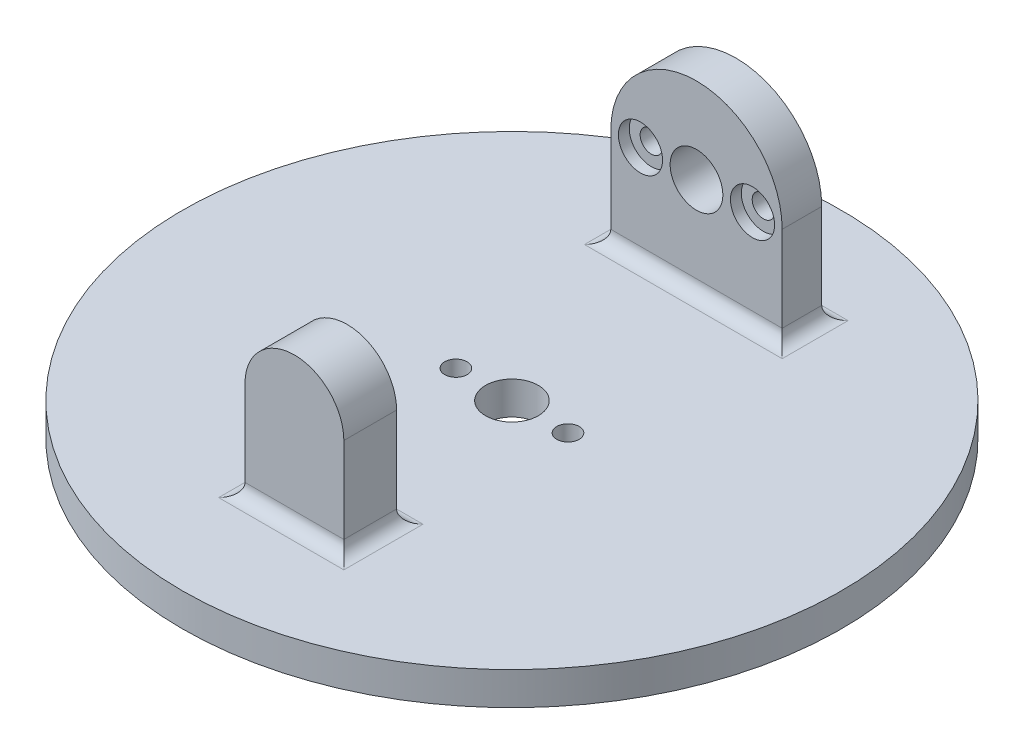
ISO-10303-21;
HEADER;
FILE_DESCRIPTION(('STEP AP214'),'2;1');
FILE_NAME('part.step','',(''),(''),'','','');
FILE_SCHEMA(('AUTOMOTIVE_DESIGN { 1 0 10303 214 1 1 1 1 }'));
ENDSEC;
DATA;
#1=APPLICATION_CONTEXT('core data for automotive mechanical design processes');
#2=APPLICATION_PROTOCOL_DEFINITION('international standard','automotive_design',2000,#1);
#3=PRODUCT_CONTEXT('',#1,'mechanical');
#4=PRODUCT('Part','Part','',(#3));
#5=PRODUCT_RELATED_PRODUCT_CATEGORY('part','',(#4));
#6=PRODUCT_DEFINITION_FORMATION('','',#4);
#7=PRODUCT_DEFINITION_CONTEXT('part definition',#1,'design');
#8=PRODUCT_DEFINITION('design','',#6,#7);
#9=PRODUCT_DEFINITION_SHAPE('','',#8);
#10=(LENGTH_UNIT() NAMED_UNIT(*) SI_UNIT(.MILLI.,.METRE.));
#11=(NAMED_UNIT(*) PLANE_ANGLE_UNIT() SI_UNIT($,.RADIAN.));
#12=(NAMED_UNIT(*) SI_UNIT($,.STERADIAN.) SOLID_ANGLE_UNIT());
#13=UNCERTAINTY_MEASURE_WITH_UNIT(LENGTH_MEASURE(1.E-05),#10,'distance_accuracy_value','');
#14=(GEOMETRIC_REPRESENTATION_CONTEXT(3) GLOBAL_UNCERTAINTY_ASSIGNED_CONTEXT((#13)) GLOBAL_UNIT_ASSIGNED_CONTEXT((#10,
#11,#12)) REPRESENTATION_CONTEXT('',''));
#15=CARTESIAN_POINT('',(0.,0.,0.));
#16=DIRECTION('',(0.,0.,1.));
#17=DIRECTION('',(1.,0.,0.));
#18=AXIS2_PLACEMENT_3D('',#15,#16,#17);
#19=CARTESIAN_POINT('',(0.,5.,0.));
#20=DIRECTION('',(0.,1.,0.));
#21=DIRECTION('',(0.,0.,1.));
#22=AXIS2_PLACEMENT_3D('',#19,#20,#21);
#23=PLANE('',#22);
#24=DIRECTION('',(1.,0.,0.));
#25=VECTOR('',#24,1.);
#26=CARTESIAN_POINT('',(0.,5.,-36.));
#27=LINE('',#26,#25);
#28=CARTESIAN_POINT('',(-15.,5.,-36.));
#29=VERTEX_POINT('',#28);
#30=CARTESIAN_POINT('',(15.,5.,-36.));
#31=VERTEX_POINT('',#30);
#32=EDGE_CURVE('E198',#29,#31,#27,.T.);
#33=ORIENTED_EDGE('',*,*,#32,.T.);
#34=DIRECTION('',(0.,0.,1.));
#35=VECTOR('',#34,1.);
#36=CARTESIAN_POINT('',(15.,5.,-28.));
#37=LINE('',#36,#35);
#38=CARTESIAN_POINT('',(15.,5.,-26.));
#39=VERTEX_POINT('',#38);
#40=EDGE_CURVE('E204',#31,#39,#37,.T.);
#41=ORIENTED_EDGE('',*,*,#40,.T.);
#42=DIRECTION('',(1.,0.,0.));
#43=VECTOR('',#42,1.);
#44=CARTESIAN_POINT('',(-13.,5.,-26.));
#45=LINE('',#44,#43);
#46=CARTESIAN_POINT('',(-15.,5.,-26.));
#47=VERTEX_POINT('',#46);
#48=EDGE_CURVE('E202',#39,#47,#45,.F.);
#49=ORIENTED_EDGE('',*,*,#48,.T.);
#50=DIRECTION('',(0.,0.,1.));
#51=VECTOR('',#50,1.);
#52=CARTESIAN_POINT('',(-15.,5.,-34.));
#53=LINE('',#52,#51);
#54=EDGE_CURVE('E200',#47,#29,#53,.F.);
#55=ORIENTED_EDGE('',*,*,#54,.T.);
#56=EDGE_LOOP('',(#33,#41,#49,#55));
#57=FACE_BOUND('',#56,.T.);
#58=DIRECTION('',(1.,0.,0.));
#59=VECTOR('',#58,1.);
#60=CARTESIAN_POINT('',(0.,5.,35.));
#61=LINE('',#60,#59);
#62=CARTESIAN_POINT('',(9.5,5.,35.));
#63=VERTEX_POINT('',#62);
#64=CARTESIAN_POINT('',(-9.5,5.,35.));
#65=VERTEX_POINT('',#64);
#66=EDGE_CURVE('E191',#63,#65,#61,.F.);
#67=ORIENTED_EDGE('',*,*,#66,.T.);
#68=DIRECTION('',(0.,0.,1.));
#69=VECTOR('',#68,1.);
#70=CARTESIAN_POINT('',(-9.5,5.,25.));
#71=LINE('',#70,#69);
#72=CARTESIAN_POINT('',(-9.5,5.,23.));
#73=VERTEX_POINT('',#72);
#74=EDGE_CURVE('E195',#65,#73,#71,.F.);
#75=ORIENTED_EDGE('',*,*,#74,.T.);
#76=DIRECTION('',(1.,0.,0.));
#77=VECTOR('',#76,1.);
#78=CARTESIAN_POINT('',(7.5,5.,23.));
#79=LINE('',#78,#77);
#80=CARTESIAN_POINT('',(9.5,5.,23.));
#81=VERTEX_POINT('',#80);
#82=EDGE_CURVE('E193',#73,#81,#79,.T.);
#83=ORIENTED_EDGE('',*,*,#82,.T.);
#84=DIRECTION('',(0.,0.,1.));
#85=VECTOR('',#84,1.);
#86=CARTESIAN_POINT('',(9.5,5.,33.));
#87=LINE('',#86,#85);
#88=EDGE_CURVE('E187',#81,#63,#87,.T.);
#89=ORIENTED_EDGE('',*,*,#88,.T.);
#90=EDGE_LOOP('',(#67,#75,#83,#89));
#91=FACE_BOUND('',#90,.T.);
#92=CARTESIAN_POINT('',(-8.49999999999999,5.,1.49186218934005E-13));
#93=DIRECTION('',(0.,1.,0.));
#94=DIRECTION('',(0.,0.,1.));
#95=AXIS2_PLACEMENT_3D('',#92,#93,#94);
#96=CIRCLE('',#95,1.7);
#97=CARTESIAN_POINT('',(-8.49999999999999,5.,1.70000000000015));
#98=VERTEX_POINT('',#97);
#99=EDGE_CURVE('E631',#98,#98,#96,.F.);
#100=ORIENTED_EDGE('',*,*,#99,.T.);
#101=EDGE_LOOP('',(#100));
#102=FACE_BOUND('',#101,.T.);
#103=CARTESIAN_POINT('',(0.,5.,0.));
#104=DIRECTION('',(0.,1.,0.));
#105=DIRECTION('',(0.,0.,1.));
#106=AXIS2_PLACEMENT_3D('',#103,#104,#105);
#107=CIRCLE('',#106,50.);
#108=CARTESIAN_POINT('',(0.,5.,50.));
#109=VERTEX_POINT('',#108);
#110=EDGE_CURVE('E184',#109,#109,#107,.T.);
#111=ORIENTED_EDGE('',*,*,#110,.T.);
#112=EDGE_LOOP('',(#111));
#113=FACE_BOUND('',#112,.T.);
#114=CARTESIAN_POINT('',(0.,5.,0.));
#115=DIRECTION('',(0.,1.,0.));
#116=DIRECTION('',(0.,0.,1.));
#117=AXIS2_PLACEMENT_3D('',#114,#115,#116);
#118=CIRCLE('',#117,4.);
#119=CARTESIAN_POINT('',(0.,5.,4.));
#120=VERTEX_POINT('',#119);
#121=EDGE_CURVE('E178',#120,#120,#118,.T.);
#122=ORIENTED_EDGE('',*,*,#121,.F.);
#123=EDGE_LOOP('',(#122));
#124=FACE_BOUND('',#123,.T.);
#125=CARTESIAN_POINT('',(8.50000000000001,5.,1.35308431126191E-13));
#126=DIRECTION('',(0.,1.,0.));
#127=DIRECTION('',(0.,0.,1.));
#128=AXIS2_PLACEMENT_3D('',#125,#126,#127);
#129=CIRCLE('',#128,1.7);
#130=CARTESIAN_POINT('',(8.50000000000001,5.,1.70000000000013));
#131=VERTEX_POINT('',#130);
#132=EDGE_CURVE('E616',#131,#131,#129,.F.);
#133=ORIENTED_EDGE('',*,*,#132,.T.);
#134=EDGE_LOOP('',(#133));
#135=FACE_BOUND('',#134,.T.);
#136=ADVANCED_FACE('F37',(#57,#91,#102,#113,#124,#135),#23,.T.);
#137=CARTESIAN_POINT('',(0.,0.,0.));
#138=DIRECTION('',(0.,1.,0.));
#139=DIRECTION('',(0.,0.,1.));
#140=AXIS2_PLACEMENT_3D('',#137,#138,#139);
#141=PLANE('',#140);
#142=CARTESIAN_POINT('',(8.50000000000001,0.,1.35308431126191E-13));
#143=DIRECTION('',(0.,-1.,0.));
#144=DIRECTION('',(0.,0.,-1.));
#145=AXIS2_PLACEMENT_3D('',#142,#143,#144);
#146=CIRCLE('',#145,3.35);
#147=CARTESIAN_POINT('',(8.50000000000001,0.,-3.34999999999987));
#148=VERTEX_POINT('',#147);
#149=EDGE_CURVE('E618',#148,#148,#146,.T.);
#150=ORIENTED_EDGE('',*,*,#149,.F.);
#151=EDGE_LOOP('',(#150));
#152=FACE_BOUND('',#151,.T.);
#153=CARTESIAN_POINT('',(-8.49999999999999,0.,1.49186218934005E-13));
#154=DIRECTION('',(0.,-1.,0.));
#155=DIRECTION('',(0.,0.,-1.));
#156=AXIS2_PLACEMENT_3D('',#153,#154,#155);
#157=CIRCLE('',#156,3.35);
#158=CARTESIAN_POINT('',(-8.49999999999999,0.,-3.34999999999985));
#159=VERTEX_POINT('',#158);
#160=EDGE_CURVE('E634',#159,#159,#157,.T.);
#161=ORIENTED_EDGE('',*,*,#160,.F.);
#162=EDGE_LOOP('',(#161));
#163=FACE_BOUND('',#162,.T.);
#164=CARTESIAN_POINT('',(0.,0.,0.));
#165=DIRECTION('',(0.,1.,0.));
#166=DIRECTION('',(0.,0.,1.));
#167=AXIS2_PLACEMENT_3D('',#164,#165,#166);
#168=CIRCLE('',#167,50.);
#169=CARTESIAN_POINT('',(0.,0.,50.));
#170=VERTEX_POINT('',#169);
#171=EDGE_CURVE('E181',#170,#170,#168,.T.);
#172=ORIENTED_EDGE('',*,*,#171,.F.);
#173=EDGE_LOOP('',(#172));
#174=FACE_BOUND('',#173,.T.);
#175=CARTESIAN_POINT('',(0.,0.,0.));
#176=DIRECTION('',(0.,1.,0.));
#177=DIRECTION('',(0.,0.,1.));
#178=AXIS2_PLACEMENT_3D('',#175,#176,#177);
#179=CIRCLE('',#178,4.);
#180=CARTESIAN_POINT('',(0.,0.,4.));
#181=VERTEX_POINT('',#180);
#182=EDGE_CURVE('E175',#181,#181,#179,.T.);
#183=ORIENTED_EDGE('',*,*,#182,.T.);
#184=EDGE_LOOP('',(#183));
#185=FACE_BOUND('',#184,.T.);
#186=ADVANCED_FACE('F276',(#152,#163,#174,#185),#141,.F.);
#187=CARTESIAN_POINT('',(0.,5.,0.));
#188=DIRECTION('',(0.,-1.,0.));
#189=DIRECTION('',(0.,0.,-1.));
#190=AXIS2_PLACEMENT_3D('',#187,#188,#189);
#191=CYLINDRICAL_SURFACE('',#190,50.);
#192=ORIENTED_EDGE('',*,*,#110,.F.);
#193=EDGE_LOOP('',(#192));
#194=FACE_BOUND('',#193,.T.);
#195=ORIENTED_EDGE('',*,*,#171,.T.);
#196=EDGE_LOOP('',(#195));
#197=FACE_BOUND('',#196,.T.);
#198=ADVANCED_FACE('F281',(#194,#197),#191,.T.);
#199=CARTESIAN_POINT('',(0.,5.,0.));
#200=DIRECTION('',(0.,-1.,0.));
#201=DIRECTION('',(0.,0.,-1.));
#202=AXIS2_PLACEMENT_3D('',#199,#200,#201);
#203=CYLINDRICAL_SURFACE('',#202,4.);
#204=ORIENTED_EDGE('',*,*,#121,.T.);
#205=EDGE_LOOP('',(#204));
#206=FACE_BOUND('',#205,.T.);
#207=ORIENTED_EDGE('',*,*,#182,.F.);
#208=EDGE_LOOP('',(#207));
#209=FACE_BOUND('',#208,.T.);
#210=ADVANCED_FACE('F285',(#206,#209),#203,.F.);
#211=CARTESIAN_POINT('',(-13.,5.,-34.));
#212=DIRECTION('',(-1.,0.,0.));
#213=DIRECTION('',(0.,-1.,0.));
#214=AXIS2_PLACEMENT_3D('',#211,#212,#213);
#215=PLANE('',#214);
#216=DIRECTION('',(0.,-1.,0.));
#217=VECTOR('',#216,1.);
#218=CARTESIAN_POINT('',(-13.,5.,-34.));
#219=LINE('',#218,#217);
#220=CARTESIAN_POINT('',(-13.,20.,-34.));
#221=VERTEX_POINT('',#220);
#222=CARTESIAN_POINT('',(-13.,7.,-34.));
#223=VERTEX_POINT('',#222);
#224=EDGE_CURVE('E163',#221,#223,#219,.T.);
#225=ORIENTED_EDGE('',*,*,#224,.T.);
#226=DIRECTION('',(0.,0.,1.));
#227=VECTOR('',#226,1.);
#228=CARTESIAN_POINT('',(-13.,7.,-28.));
#229=LINE('',#228,#227);
#230=CARTESIAN_POINT('',(-13.,7.,-28.));
#231=VERTEX_POINT('',#230);
#232=EDGE_CURVE('E212',#223,#231,#229,.T.);
#233=ORIENTED_EDGE('',*,*,#232,.T.);
#234=DIRECTION('',(0.,-1.,0.));
#235=VECTOR('',#234,1.);
#236=CARTESIAN_POINT('',(-13.,5.,-28.));
#237=LINE('',#236,#235);
#238=CARTESIAN_POINT('',(-13.,20.,-28.));
#239=VERTEX_POINT('',#238);
#240=EDGE_CURVE('E160',#239,#231,#237,.T.);
#241=ORIENTED_EDGE('',*,*,#240,.F.);
#242=DIRECTION('',(0.,0.,1.));
#243=VECTOR('',#242,1.);
#244=CARTESIAN_POINT('',(-13.,20.,-34.));
#245=LINE('',#244,#243);
#246=EDGE_CURVE('E173',#221,#239,#245,.T.);
#247=ORIENTED_EDGE('',*,*,#246,.F.);
#248=EDGE_LOOP('',(#225,#233,#241,#247));
#249=FACE_BOUND('',#248,.T.);
#250=ADVANCED_FACE('F517',(#249),#215,.T.);
#251=CARTESIAN_POINT('',(0.,20.,-34.));
#252=DIRECTION('',(0.,0.,1.));
#253=DIRECTION('',(1.,0.,0.));
#254=AXIS2_PLACEMENT_3D('',#251,#252,#253);
#255=CYLINDRICAL_SURFACE('',#254,13.);
#256=CARTESIAN_POINT('',(0.,20.,-28.));
#257=DIRECTION('',(0.,0.,1.));
#258=DIRECTION('',(1.,0.,0.));
#259=AXIS2_PLACEMENT_3D('',#256,#257,#258);
#260=CIRCLE('',#259,13.);
#261=CARTESIAN_POINT('',(13.,20.,-28.));
#262=VERTEX_POINT('',#261);
#263=EDGE_CURVE('E168',#262,#239,#260,.T.);
#264=ORIENTED_EDGE('',*,*,#263,.F.);
#265=DIRECTION('',(0.,0.,1.));
#266=VECTOR('',#265,1.);
#267=CARTESIAN_POINT('',(13.,20.,-34.));
#268=LINE('',#267,#266);
#269=CARTESIAN_POINT('',(13.,20.,-34.));
#270=VERTEX_POINT('',#269);
#271=EDGE_CURVE('E166',#270,#262,#268,.T.);
#272=ORIENTED_EDGE('',*,*,#271,.F.);
#273=CARTESIAN_POINT('',(0.,20.,-34.));
#274=DIRECTION('',(0.,0.,1.));
#275=DIRECTION('',(1.,0.,0.));
#276=AXIS2_PLACEMENT_3D('',#273,#274,#275);
#277=CIRCLE('',#276,13.);
#278=EDGE_CURVE('E159',#270,#221,#277,.T.);
#279=ORIENTED_EDGE('',*,*,#278,.T.);
#280=ORIENTED_EDGE('',*,*,#246,.T.);
#281=EDGE_LOOP('',(#264,#272,#279,#280));
#282=FACE_BOUND('',#281,.T.);
#283=ADVANCED_FACE('F508',(#282),#255,.T.);
#284=CARTESIAN_POINT('',(13.,5.,-34.));
#285=DIRECTION('',(1.,0.,0.));
#286=DIRECTION('',(0.,0.,-1.));
#287=AXIS2_PLACEMENT_3D('',#284,#285,#286);
#288=PLANE('',#287);
#289=DIRECTION('',(0.,1.,0.));
#290=VECTOR('',#289,1.);
#291=CARTESIAN_POINT('',(13.,5.,-28.));
#292=LINE('',#291,#290);
#293=CARTESIAN_POINT('',(13.,7.,-28.));
#294=VERTEX_POINT('',#293);
#295=EDGE_CURVE('E155',#294,#262,#292,.T.);
#296=ORIENTED_EDGE('',*,*,#295,.F.);
#297=DIRECTION('',(0.,0.,1.));
#298=VECTOR('',#297,1.);
#299=CARTESIAN_POINT('',(13.,7.,-34.));
#300=LINE('',#299,#298);
#301=CARTESIAN_POINT('',(13.,7.,-34.));
#302=VERTEX_POINT('',#301);
#303=EDGE_CURVE('E207',#294,#302,#300,.F.);
#304=ORIENTED_EDGE('',*,*,#303,.T.);
#305=DIRECTION('',(0.,1.,0.));
#306=VECTOR('',#305,1.);
#307=CARTESIAN_POINT('',(13.,5.,-34.));
#308=LINE('',#307,#306);
#309=EDGE_CURVE('E157',#302,#270,#308,.T.);
#310=ORIENTED_EDGE('',*,*,#309,.T.);
#311=ORIENTED_EDGE('',*,*,#271,.T.);
#312=EDGE_LOOP('',(#296,#304,#310,#311));
#313=FACE_BOUND('',#312,.T.);
#314=ADVANCED_FACE('F498',(#313),#288,.T.);
#315=CARTESIAN_POINT('',(0.,20.,-34.));
#316=DIRECTION('',(0.,0.,1.));
#317=DIRECTION('',(1.,0.,0.));
#318=AXIS2_PLACEMENT_3D('',#315,#316,#317);
#319=PLANE('',#318);
#320=CARTESIAN_POINT('',(0.,20.,-34.));
#321=DIRECTION('',(0.,0.,1.));
#322=DIRECTION('',(1.,0.,0.));
#323=AXIS2_PLACEMENT_3D('',#320,#321,#322);
#324=CIRCLE('',#323,4.);
#325=CARTESIAN_POINT('',(4.,20.,-34.));
#326=VERTEX_POINT('',#325);
#327=EDGE_CURVE('E675',#326,#326,#324,.F.);
#328=ORIENTED_EDGE('',*,*,#327,.F.);
#329=EDGE_LOOP('',(#328));
#330=FACE_BOUND('',#329,.T.);
#331=CARTESIAN_POINT('',(8.50000000000001,20.,-34.));
#332=DIRECTION('',(0.,0.,1.));
#333=DIRECTION('',(1.,0.,0.));
#334=AXIS2_PLACEMENT_3D('',#331,#332,#333);
#335=CIRCLE('',#334,1.7);
#336=CARTESIAN_POINT('',(10.2,20.,-34.));
#337=VERTEX_POINT('',#336);
#338=EDGE_CURVE('E663',#337,#337,#335,.F.);
#339=ORIENTED_EDGE('',*,*,#338,.F.);
#340=EDGE_LOOP('',(#339));
#341=FACE_BOUND('',#340,.T.);
#342=CARTESIAN_POINT('',(-8.5,20.,-34.));
#343=DIRECTION('',(0.,0.,1.));
#344=DIRECTION('',(1.,0.,0.));
#345=AXIS2_PLACEMENT_3D('',#342,#343,#344);
#346=CIRCLE('',#345,1.7);
#347=CARTESIAN_POINT('',(-6.8,20.,-34.));
#348=VERTEX_POINT('',#347);
#349=EDGE_CURVE('E624',#348,#348,#346,.F.);
#350=ORIENTED_EDGE('',*,*,#349,.F.);
#351=EDGE_LOOP('',(#350));
#352=FACE_BOUND('',#351,.T.);
#353=ORIENTED_EDGE('',*,*,#309,.F.);
#354=DIRECTION('',(1.,0.,0.));
#355=VECTOR('',#354,1.);
#356=CARTESIAN_POINT('',(0.,7.,-34.));
#357=LINE('',#356,#355);
#358=EDGE_CURVE('E214',#302,#223,#357,.F.);
#359=ORIENTED_EDGE('',*,*,#358,.T.);
#360=ORIENTED_EDGE('',*,*,#224,.F.);
#361=ORIENTED_EDGE('',*,*,#278,.F.);
#362=EDGE_LOOP('',(#353,#359,#360,#361));
#363=FACE_BOUND('',#362,.T.);
#364=ADVANCED_FACE('F488',(#330,#341,#352,#363),#319,.F.);
#365=CARTESIAN_POINT('',(0.,20.,-28.));
#366=DIRECTION('',(0.,0.,1.));
#367=DIRECTION('',(1.,0.,0.));
#368=AXIS2_PLACEMENT_3D('',#365,#366,#367);
#369=PLANE('',#368);
#370=CARTESIAN_POINT('',(0.,20.,-28.));
#371=DIRECTION('',(0.,0.,1.));
#372=DIRECTION('',(1.,0.,0.));
#373=AXIS2_PLACEMENT_3D('',#370,#371,#372);
#374=CIRCLE('',#373,4.);
#375=CARTESIAN_POINT('',(4.,20.,-28.));
#376=VERTEX_POINT('',#375);
#377=EDGE_CURVE('E680',#376,#376,#374,.T.);
#378=ORIENTED_EDGE('',*,*,#377,.F.);
#379=EDGE_LOOP('',(#378));
#380=FACE_BOUND('',#379,.T.);
#381=CARTESIAN_POINT('',(8.50000000000001,20.,-28.));
#382=DIRECTION('',(0.,0.,1.));
#383=DIRECTION('',(1.,0.,0.));
#384=AXIS2_PLACEMENT_3D('',#381,#382,#383);
#385=CIRCLE('',#384,3.35);
#386=CARTESIAN_POINT('',(11.85,20.,-28.));
#387=VERTEX_POINT('',#386);
#388=EDGE_CURVE('E672',#387,#387,#385,.T.);
#389=ORIENTED_EDGE('',*,*,#388,.F.);
#390=EDGE_LOOP('',(#389));
#391=FACE_BOUND('',#390,.T.);
#392=CARTESIAN_POINT('',(-8.5,20.,-28.));
#393=DIRECTION('',(0.,0.,1.));
#394=DIRECTION('',(1.,0.,0.));
#395=AXIS2_PLACEMENT_3D('',#392,#393,#394);
#396=CIRCLE('',#395,3.35);
#397=CARTESIAN_POINT('',(-5.15,20.,-28.));
#398=VERTEX_POINT('',#397);
#399=EDGE_CURVE('E660',#398,#398,#396,.T.);
#400=ORIENTED_EDGE('',*,*,#399,.F.);
#401=EDGE_LOOP('',(#400));
#402=FACE_BOUND('',#401,.T.);
#403=ORIENTED_EDGE('',*,*,#240,.T.);
#404=DIRECTION('',(1.,0.,0.));
#405=VECTOR('',#404,1.);
#406=CARTESIAN_POINT('',(13.,7.,-28.));
#407=LINE('',#406,#405);
#408=EDGE_CURVE('E210',#231,#294,#407,.T.);
#409=ORIENTED_EDGE('',*,*,#408,.T.);
#410=ORIENTED_EDGE('',*,*,#295,.T.);
#411=ORIENTED_EDGE('',*,*,#263,.T.);
#412=EDGE_LOOP('',(#403,#409,#410,#411));
#413=FACE_BOUND('',#412,.T.);
#414=ADVANCED_FACE('F480',(#380,#391,#402,#413),#369,.T.);
#415=CARTESIAN_POINT('',(-7.5,5.,25.));
#416=DIRECTION('',(-1.,0.,0.));
#417=DIRECTION('',(0.,0.,1.));
#418=AXIS2_PLACEMENT_3D('',#415,#416,#417);
#419=PLANE('',#418);
#420=DIRECTION('',(0.,-1.,0.));
#421=VECTOR('',#420,1.);
#422=CARTESIAN_POINT('',(-7.5,5.,25.));
#423=LINE('',#422,#421);
#424=CARTESIAN_POINT('',(-7.5,20.,25.));
#425=VERTEX_POINT('',#424);
#426=CARTESIAN_POINT('',(-7.5,7.,25.));
#427=VERTEX_POINT('',#426);
#428=EDGE_CURVE('E142',#425,#427,#423,.T.);
#429=ORIENTED_EDGE('',*,*,#428,.T.);
#430=DIRECTION('',(0.,0.,1.));
#431=VECTOR('',#430,1.);
#432=CARTESIAN_POINT('',(-7.5,7.,33.));
#433=LINE('',#432,#431);
#434=CARTESIAN_POINT('',(-7.5,7.,33.));
#435=VERTEX_POINT('',#434);
#436=EDGE_CURVE('E216',#427,#435,#433,.T.);
#437=ORIENTED_EDGE('',*,*,#436,.T.);
#438=DIRECTION('',(0.,-1.,0.));
#439=VECTOR('',#438,1.);
#440=CARTESIAN_POINT('',(-7.5,5.,33.));
#441=LINE('',#440,#439);
#442=CARTESIAN_POINT('',(-7.5,20.,33.));
#443=VERTEX_POINT('',#442);
#444=EDGE_CURVE('E133',#443,#435,#441,.T.);
#445=ORIENTED_EDGE('',*,*,#444,.F.);
#446=DIRECTION('',(0.,0.,1.));
#447=VECTOR('',#446,1.);
#448=CARTESIAN_POINT('',(-7.5,20.,25.));
#449=LINE('',#448,#447);
#450=EDGE_CURVE('E141',#425,#443,#449,.T.);
#451=ORIENTED_EDGE('',*,*,#450,.F.);
#452=EDGE_LOOP('',(#429,#437,#445,#451));
#453=FACE_BOUND('',#452,.T.);
#454=ADVANCED_FACE('F259',(#453),#419,.T.);
#455=CARTESIAN_POINT('',(0.,20.,25.));
#456=DIRECTION('',(0.,0.,1.));
#457=DIRECTION('',(1.,0.,0.));
#458=AXIS2_PLACEMENT_3D('',#455,#456,#457);
#459=CYLINDRICAL_SURFACE('',#458,7.5);
#460=CARTESIAN_POINT('',(0.,20.,33.));
#461=DIRECTION('',(0.,0.,1.));
#462=DIRECTION('',(-1.,0.,0.));
#463=AXIS2_PLACEMENT_3D('',#460,#461,#462);
#464=CIRCLE('',#463,7.5);
#465=CARTESIAN_POINT('',(7.5,20.,33.));
#466=VERTEX_POINT('',#465);
#467=EDGE_CURVE('E140',#466,#443,#464,.T.);
#468=ORIENTED_EDGE('',*,*,#467,.F.);
#469=DIRECTION('',(0.,0.,1.));
#470=VECTOR('',#469,1.);
#471=CARTESIAN_POINT('',(7.5,20.,25.));
#472=LINE('',#471,#470);
#473=CARTESIAN_POINT('',(7.5,20.,25.));
#474=VERTEX_POINT('',#473);
#475=EDGE_CURVE('E127',#474,#466,#472,.T.);
#476=ORIENTED_EDGE('',*,*,#475,.F.);
#477=CARTESIAN_POINT('',(0.,20.,25.));
#478=DIRECTION('',(0.,0.,1.));
#479=DIRECTION('',(-1.,0.,0.));
#480=AXIS2_PLACEMENT_3D('',#477,#478,#479);
#481=CIRCLE('',#480,7.5);
#482=EDGE_CURVE('E132',#474,#425,#481,.T.);
#483=ORIENTED_EDGE('',*,*,#482,.T.);
#484=ORIENTED_EDGE('',*,*,#450,.T.);
#485=EDGE_LOOP('',(#468,#476,#483,#484));
#486=FACE_BOUND('',#485,.T.);
#487=ADVANCED_FACE('F137',(#486),#459,.T.);
#488=CARTESIAN_POINT('',(7.5,5.,25.));
#489=DIRECTION('',(1.,0.,0.));
#490=DIRECTION('',(0.,0.,-1.));
#491=AXIS2_PLACEMENT_3D('',#488,#489,#490);
#492=PLANE('',#491);
#493=DIRECTION('',(0.,1.,0.));
#494=VECTOR('',#493,1.);
#495=CARTESIAN_POINT('',(7.5,5.,33.));
#496=LINE('',#495,#494);
#497=CARTESIAN_POINT('',(7.5,7.,33.));
#498=VERTEX_POINT('',#497);
#499=EDGE_CURVE('E150',#498,#466,#496,.T.);
#500=ORIENTED_EDGE('',*,*,#499,.F.);
#501=DIRECTION('',(0.,0.,1.));
#502=VECTOR('',#501,1.);
#503=CARTESIAN_POINT('',(7.5,7.,25.));
#504=LINE('',#503,#502);
#505=CARTESIAN_POINT('',(7.5,7.,25.));
#506=VERTEX_POINT('',#505);
#507=EDGE_CURVE('E11',#498,#506,#504,.F.);
#508=ORIENTED_EDGE('',*,*,#507,.T.);
#509=DIRECTION('',(0.,1.,0.));
#510=VECTOR('',#509,1.);
#511=CARTESIAN_POINT('',(7.5,5.,25.));
#512=LINE('',#511,#510);
#513=EDGE_CURVE('E124',#506,#474,#512,.T.);
#514=ORIENTED_EDGE('',*,*,#513,.T.);
#515=ORIENTED_EDGE('',*,*,#475,.T.);
#516=EDGE_LOOP('',(#500,#508,#514,#515));
#517=FACE_BOUND('',#516,.T.);
#518=ADVANCED_FACE('F126',(#517),#492,.T.);
#519=CARTESIAN_POINT('',(0.,20.,25.));
#520=DIRECTION('',(0.,0.,-1.));
#521=DIRECTION('',(-1.,0.,0.));
#522=AXIS2_PLACEMENT_3D('',#519,#520,#521);
#523=PLANE('',#522);
#524=CARTESIAN_POINT('',(0.,19.9243511029579,25.));
#525=DIRECTION('',(0.,0.,-1.));
#526=DIRECTION('',(-1.,0.,0.));
#527=AXIS2_PLACEMENT_3D('',#524,#525,#526);
#528=CIRCLE('',#527,5.25);
#529=CARTESIAN_POINT('',(-5.25,19.9243511029579,25.));
#530=VERTEX_POINT('',#529);
#531=EDGE_CURVE('E232',#530,#530,#528,.T.);
#532=ORIENTED_EDGE('',*,*,#531,.F.);
#533=EDGE_LOOP('',(#532));
#534=FACE_BOUND('',#533,.T.);
#535=ORIENTED_EDGE('',*,*,#513,.F.);
#536=DIRECTION('',(1.,0.,0.));
#537=VECTOR('',#536,1.);
#538=CARTESIAN_POINT('',(-7.5,7.,25.));
#539=LINE('',#538,#537);
#540=EDGE_CURVE('E219',#506,#427,#539,.F.);
#541=ORIENTED_EDGE('',*,*,#540,.T.);
#542=ORIENTED_EDGE('',*,*,#428,.F.);
#543=ORIENTED_EDGE('',*,*,#482,.F.);
#544=EDGE_LOOP('',(#535,#541,#542,#543));
#545=FACE_BOUND('',#544,.T.);
#546=ADVANCED_FACE('F144',(#534,#545),#523,.T.);
#547=CARTESIAN_POINT('',(0.,20.,33.));
#548=DIRECTION('',(0.,0.,-1.));
#549=DIRECTION('',(-1.,0.,0.));
#550=AXIS2_PLACEMENT_3D('',#547,#548,#549);
#551=PLANE('',#550);
#552=ORIENTED_EDGE('',*,*,#444,.T.);
#553=DIRECTION('',(1.,0.,0.));
#554=VECTOR('',#553,1.);
#555=CARTESIAN_POINT('',(0.,7.,33.));
#556=LINE('',#555,#554);
#557=EDGE_CURVE('E46',#435,#498,#556,.T.);
#558=ORIENTED_EDGE('',*,*,#557,.T.);
#559=ORIENTED_EDGE('',*,*,#499,.T.);
#560=ORIENTED_EDGE('',*,*,#467,.T.);
#561=EDGE_LOOP('',(#552,#558,#559,#560));
#562=FACE_BOUND('',#561,.T.);
#563=ADVANCED_FACE('F260',(#562),#551,.F.);
#564=CARTESIAN_POINT('',(-8.49999999999999,0.,1.49186218934005E-13));
#565=DIRECTION('',(0.,-1.,0.));
#566=DIRECTION('',(0.,0.,-1.));
#567=AXIS2_PLACEMENT_3D('',#564,#565,#566);
#568=CYLINDRICAL_SURFACE('',#567,1.7);
#569=ORIENTED_EDGE('',*,*,#99,.F.);
#570=EDGE_LOOP('',(#569));
#571=FACE_BOUND('',#570,.T.);
#572=CARTESIAN_POINT('',(-8.49999999999999,1.65,1.49186218934005E-13));
#573=DIRECTION('',(0.,-1.,0.));
#574=DIRECTION('',(0.,0.,-1.));
#575=AXIS2_PLACEMENT_3D('',#572,#573,#574);
#576=CIRCLE('',#575,1.7);
#577=CARTESIAN_POINT('',(-8.49999999999999,1.65,-1.69999999999985));
#578=VERTEX_POINT('',#577);
#579=EDGE_CURVE('E628',#578,#578,#576,.T.);
#580=ORIENTED_EDGE('',*,*,#579,.T.);
#581=EDGE_LOOP('',(#580));
#582=FACE_BOUND('',#581,.T.);
#583=ADVANCED_FACE('F262',(#571,#582),#568,.F.);
#584=CARTESIAN_POINT('',(-6.79999999999999,1.65,1.49186218934005E-13));
#585=DIRECTION('',(0.,1.,0.));
#586=DIRECTION('',(0.,0.,1.));
#587=AXIS2_PLACEMENT_3D('',#584,#585,#586);
#588=PLANE('',#587);
#589=ORIENTED_EDGE('',*,*,#579,.F.);
#590=EDGE_LOOP('',(#589));
#591=FACE_BOUND('',#590,.T.);
#592=CARTESIAN_POINT('',(-8.49999999999999,1.65,1.49186218934005E-13));
#593=DIRECTION('',(0.,-1.,0.));
#594=DIRECTION('',(0.,0.,-1.));
#595=AXIS2_PLACEMENT_3D('',#592,#593,#594);
#596=CIRCLE('',#595,3.35);
#597=CARTESIAN_POINT('',(-8.49999999999999,1.65,-3.34999999999985));
#598=VERTEX_POINT('',#597);
#599=EDGE_CURVE('E152',#598,#598,#596,.T.);
#600=ORIENTED_EDGE('',*,*,#599,.T.);
#601=EDGE_LOOP('',(#600));
#602=FACE_BOUND('',#601,.T.);
#603=ADVANCED_FACE('F269',(#591,#602),#588,.F.);
#604=CARTESIAN_POINT('',(-8.49999999999999,0.,1.49186218934005E-13));
#605=DIRECTION('',(0.,-1.,0.));
#606=DIRECTION('',(0.,0.,-1.));
#607=AXIS2_PLACEMENT_3D('',#604,#605,#606);
#608=CYLINDRICAL_SURFACE('',#607,3.35);
#609=ORIENTED_EDGE('',*,*,#599,.F.);
#610=EDGE_LOOP('',(#609));
#611=FACE_BOUND('',#610,.T.);
#612=ORIENTED_EDGE('',*,*,#160,.T.);
#613=EDGE_LOOP('',(#612));
#614=FACE_BOUND('',#613,.T.);
#615=ADVANCED_FACE('F426',(#611,#614),#608,.F.);
#616=CARTESIAN_POINT('',(8.50000000000001,0.,1.35308431126191E-13));
#617=DIRECTION('',(0.,-1.,0.));
#618=DIRECTION('',(0.,0.,-1.));
#619=AXIS2_PLACEMENT_3D('',#616,#617,#618);
#620=CYLINDRICAL_SURFACE('',#619,1.7);
#621=ORIENTED_EDGE('',*,*,#132,.F.);
#622=EDGE_LOOP('',(#621));
#623=FACE_BOUND('',#622,.T.);
#624=CARTESIAN_POINT('',(8.50000000000001,1.65,1.35308431126191E-13));
#625=DIRECTION('',(0.,-1.,0.));
#626=DIRECTION('',(0.,0.,-1.));
#627=AXIS2_PLACEMENT_3D('',#624,#625,#626);
#628=CIRCLE('',#627,1.7);
#629=CARTESIAN_POINT('',(8.50000000000001,1.65,-1.69999999999986));
#630=VERTEX_POINT('',#629);
#631=EDGE_CURVE('E617',#630,#630,#628,.T.);
#632=ORIENTED_EDGE('',*,*,#631,.T.);
#633=EDGE_LOOP('',(#632));
#634=FACE_BOUND('',#633,.T.);
#635=ADVANCED_FACE('F418',(#623,#634),#620,.F.);
#636=CARTESIAN_POINT('',(10.2,1.65,1.35308431126191E-13));
#637=DIRECTION('',(0.,1.,0.));
#638=DIRECTION('',(0.,0.,1.));
#639=AXIS2_PLACEMENT_3D('',#636,#637,#638);
#640=PLANE('',#639);
#641=ORIENTED_EDGE('',*,*,#631,.F.);
#642=EDGE_LOOP('',(#641));
#643=FACE_BOUND('',#642,.T.);
#644=CARTESIAN_POINT('',(8.50000000000001,1.65,1.35308431126191E-13));
#645=DIRECTION('',(0.,-1.,0.));
#646=DIRECTION('',(0.,0.,-1.));
#647=AXIS2_PLACEMENT_3D('',#644,#645,#646);
#648=CIRCLE('',#647,3.35);
#649=CARTESIAN_POINT('',(8.50000000000001,1.65,-3.34999999999987));
#650=VERTEX_POINT('',#649);
#651=EDGE_CURVE('E621',#650,#650,#648,.T.);
#652=ORIENTED_EDGE('',*,*,#651,.T.);
#653=EDGE_LOOP('',(#652));
#654=FACE_BOUND('',#653,.T.);
#655=ADVANCED_FACE('F410',(#643,#654),#640,.F.);
#656=CARTESIAN_POINT('',(8.50000000000001,0.,1.35308431126191E-13));
#657=DIRECTION('',(0.,-1.,0.));
#658=DIRECTION('',(0.,0.,-1.));
#659=AXIS2_PLACEMENT_3D('',#656,#657,#658);
#660=CYLINDRICAL_SURFACE('',#659,3.35);
#661=ORIENTED_EDGE('',*,*,#651,.F.);
#662=EDGE_LOOP('',(#661));
#663=FACE_BOUND('',#662,.T.);
#664=ORIENTED_EDGE('',*,*,#149,.T.);
#665=EDGE_LOOP('',(#664));
#666=FACE_BOUND('',#665,.T.);
#667=ADVANCED_FACE('F402',(#663,#666),#660,.F.);
#668=CARTESIAN_POINT('',(-8.5,20.,-28.));
#669=DIRECTION('',(0.,0.,1.));
#670=DIRECTION('',(1.,0.,0.));
#671=AXIS2_PLACEMENT_3D('',#668,#669,#670);
#672=CYLINDRICAL_SURFACE('',#671,1.7);
#673=ORIENTED_EDGE('',*,*,#349,.T.);
#674=EDGE_LOOP('',(#673));
#675=FACE_BOUND('',#674,.T.);
#676=CARTESIAN_POINT('',(-8.5,20.,-29.65));
#677=DIRECTION('',(0.,0.,1.));
#678=DIRECTION('',(1.,0.,0.));
#679=AXIS2_PLACEMENT_3D('',#676,#677,#678);
#680=CIRCLE('',#679,1.7);
#681=CARTESIAN_POINT('',(-6.8,20.,-29.65));
#682=VERTEX_POINT('',#681);
#683=EDGE_CURVE('E654',#682,#682,#680,.T.);
#684=ORIENTED_EDGE('',*,*,#683,.T.);
#685=EDGE_LOOP('',(#684));
#686=FACE_BOUND('',#685,.T.);
#687=ADVANCED_FACE('F394',(#675,#686),#672,.F.);
#688=CARTESIAN_POINT('',(-6.8,20.,-29.65));
#689=DIRECTION('',(0.,0.,-1.));
#690=DIRECTION('',(-1.,0.,0.));
#691=AXIS2_PLACEMENT_3D('',#688,#689,#690);
#692=PLANE('',#691);
#693=ORIENTED_EDGE('',*,*,#683,.F.);
#694=EDGE_LOOP('',(#693));
#695=FACE_BOUND('',#694,.T.);
#696=CARTESIAN_POINT('',(-8.5,20.,-29.65));
#697=DIRECTION('',(0.,0.,1.));
#698=DIRECTION('',(1.,0.,0.));
#699=AXIS2_PLACEMENT_3D('',#696,#697,#698);
#700=CIRCLE('',#699,3.35);
#701=CARTESIAN_POINT('',(-5.15,20.,-29.65));
#702=VERTEX_POINT('',#701);
#703=EDGE_CURVE('E657',#702,#702,#700,.T.);
#704=ORIENTED_EDGE('',*,*,#703,.T.);
#705=EDGE_LOOP('',(#704));
#706=FACE_BOUND('',#705,.T.);
#707=ADVANCED_FACE('F386',(#695,#706),#692,.F.);
#708=CARTESIAN_POINT('',(-8.5,20.,-28.));
#709=DIRECTION('',(0.,0.,1.));
#710=DIRECTION('',(1.,0.,0.));
#711=AXIS2_PLACEMENT_3D('',#708,#709,#710);
#712=CYLINDRICAL_SURFACE('',#711,3.35);
#713=ORIENTED_EDGE('',*,*,#703,.F.);
#714=EDGE_LOOP('',(#713));
#715=FACE_BOUND('',#714,.T.);
#716=ORIENTED_EDGE('',*,*,#399,.T.);
#717=EDGE_LOOP('',(#716));
#718=FACE_BOUND('',#717,.T.);
#719=ADVANCED_FACE('F378',(#715,#718),#712,.F.);
#720=CARTESIAN_POINT('',(8.50000000000001,20.,-28.));
#721=DIRECTION('',(0.,0.,1.));
#722=DIRECTION('',(1.,0.,0.));
#723=AXIS2_PLACEMENT_3D('',#720,#721,#722);
#724=CYLINDRICAL_SURFACE('',#723,1.7);
#725=ORIENTED_EDGE('',*,*,#338,.T.);
#726=EDGE_LOOP('',(#725));
#727=FACE_BOUND('',#726,.T.);
#728=CARTESIAN_POINT('',(8.50000000000001,20.,-29.65));
#729=DIRECTION('',(0.,0.,1.));
#730=DIRECTION('',(1.,0.,0.));
#731=AXIS2_PLACEMENT_3D('',#728,#729,#730);
#732=CIRCLE('',#731,1.7);
#733=CARTESIAN_POINT('',(10.2,20.,-29.65));
#734=VERTEX_POINT('',#733);
#735=EDGE_CURVE('E666',#734,#734,#732,.T.);
#736=ORIENTED_EDGE('',*,*,#735,.T.);
#737=EDGE_LOOP('',(#736));
#738=FACE_BOUND('',#737,.T.);
#739=ADVANCED_FACE('F370',(#727,#738),#724,.F.);
#740=CARTESIAN_POINT('',(10.2,20.,-29.65));
#741=DIRECTION('',(0.,0.,-1.));
#742=DIRECTION('',(-1.,0.,0.));
#743=AXIS2_PLACEMENT_3D('',#740,#741,#742);
#744=PLANE('',#743);
#745=ORIENTED_EDGE('',*,*,#735,.F.);
#746=EDGE_LOOP('',(#745));
#747=FACE_BOUND('',#746,.T.);
#748=CARTESIAN_POINT('',(8.50000000000001,20.,-29.65));
#749=DIRECTION('',(0.,0.,1.));
#750=DIRECTION('',(1.,0.,0.));
#751=AXIS2_PLACEMENT_3D('',#748,#749,#750);
#752=CIRCLE('',#751,3.35);
#753=CARTESIAN_POINT('',(11.85,20.,-29.65));
#754=VERTEX_POINT('',#753);
#755=EDGE_CURVE('E669',#754,#754,#752,.T.);
#756=ORIENTED_EDGE('',*,*,#755,.T.);
#757=EDGE_LOOP('',(#756));
#758=FACE_BOUND('',#757,.T.);
#759=ADVANCED_FACE('F362',(#747,#758),#744,.F.);
#760=CARTESIAN_POINT('',(8.50000000000001,20.,-28.));
#761=DIRECTION('',(0.,0.,1.));
#762=DIRECTION('',(1.,0.,0.));
#763=AXIS2_PLACEMENT_3D('',#760,#761,#762);
#764=CYLINDRICAL_SURFACE('',#763,3.35);
#765=ORIENTED_EDGE('',*,*,#755,.F.);
#766=EDGE_LOOP('',(#765));
#767=FACE_BOUND('',#766,.T.);
#768=ORIENTED_EDGE('',*,*,#388,.T.);
#769=EDGE_LOOP('',(#768));
#770=FACE_BOUND('',#769,.T.);
#771=ADVANCED_FACE('F354',(#767,#770),#764,.F.);
#772=CARTESIAN_POINT('',(0.,20.,-45.3137084989848));
#773=DIRECTION('',(0.,0.,1.));
#774=DIRECTION('',(1.,0.,0.));
#775=AXIS2_PLACEMENT_3D('',#772,#773,#774);
#776=CYLINDRICAL_SURFACE('',#775,4.);
#777=ORIENTED_EDGE('',*,*,#327,.T.);
#778=EDGE_LOOP('',(#777));
#779=FACE_BOUND('',#778,.T.);
#780=ORIENTED_EDGE('',*,*,#377,.T.);
#781=EDGE_LOOP('',(#780));
#782=FACE_BOUND('',#781,.T.);
#783=ADVANCED_FACE('F346',(#779,#782),#776,.F.);
#784=CARTESIAN_POINT('',(0.,19.9243511029579,29.));
#785=DIRECTION('',(0.,0.,-1.));
#786=DIRECTION('',(-1.,0.,0.));
#787=AXIS2_PLACEMENT_3D('',#784,#785,#786);
#788=CYLINDRICAL_SURFACE('',#787,5.25);
#789=CARTESIAN_POINT('',(0.,19.9243511029579,29.));
#790=DIRECTION('',(0.,0.,-1.));
#791=DIRECTION('',(-1.,0.,0.));
#792=AXIS2_PLACEMENT_3D('',#789,#790,#791);
#793=CIRCLE('',#792,5.25);
#794=CARTESIAN_POINT('',(-5.25,19.9243511029579,29.));
#795=VERTEX_POINT('',#794);
#796=EDGE_CURVE('E683',#795,#795,#793,.T.);
#797=ORIENTED_EDGE('',*,*,#796,.F.);
#798=EDGE_LOOP('',(#797));
#799=FACE_BOUND('',#798,.T.);
#800=ORIENTED_EDGE('',*,*,#531,.T.);
#801=EDGE_LOOP('',(#800));
#802=FACE_BOUND('',#801,.T.);
#803=ADVANCED_FACE('F338',(#799,#802),#788,.F.);
#804=CARTESIAN_POINT('',(0.,19.9243511029579,29.));
#805=DIRECTION('',(0.,0.,-1.));
#806=DIRECTION('',(-1.,0.,0.));
#807=AXIS2_PLACEMENT_3D('',#804,#805,#806);
#808=PLANE('',#807);
#809=ORIENTED_EDGE('',*,*,#796,.T.);
#810=EDGE_LOOP('',(#809));
#811=FACE_BOUND('',#810,.T.);
#812=ADVANCED_FACE('F306',(#811),#808,.T.);
#813=CARTESIAN_POINT('',(-15.,7.,-34.));
#814=DIRECTION('',(0.,0.,-1.));
#815=DIRECTION('',(-1.,0.,0.));
#816=AXIS2_PLACEMENT_3D('',#813,#814,#815);
#817=CYLINDRICAL_SURFACE('',#816,2.);
#818=CARTESIAN_POINT('',(-15.,7.,-26.));
#819=DIRECTION('',(-0.707106781186547,0.,-0.707106781186547));
#820=DIRECTION('',(0.707106781186547,0.,-0.707106781186547));
#821=AXIS2_PLACEMENT_3D('',#818,#819,#820);
#822=ELLIPSE('',#821,2.82842712474619,2.);
#823=EDGE_CURVE('E226',#231,#47,#822,.T.);
#824=ORIENTED_EDGE('',*,*,#823,.F.);
#825=ORIENTED_EDGE('',*,*,#232,.F.);
#826=CARTESIAN_POINT('',(-15.,7.,-36.));
#827=DIRECTION('',(0.707106781186547,0.,-0.707106781186547));
#828=DIRECTION('',(0.707106781186547,0.,0.707106781186547));
#829=AXIS2_PLACEMENT_3D('',#826,#827,#828);
#830=ELLIPSE('',#829,2.82842712474619,2.);
#831=EDGE_CURVE('E229',#29,#223,#830,.F.);
#832=ORIENTED_EDGE('',*,*,#831,.F.);
#833=ORIENTED_EDGE('',*,*,#54,.F.);
#834=EDGE_LOOP('',(#824,#825,#832,#833));
#835=FACE_BOUND('',#834,.T.);
#836=ADVANCED_FACE('F302',(#835),#817,.F.);
#837=CARTESIAN_POINT('',(0.,7.,-36.));
#838=DIRECTION('',(1.,0.,0.));
#839=DIRECTION('',(0.,0.,-1.));
#840=AXIS2_PLACEMENT_3D('',#837,#838,#839);
#841=CYLINDRICAL_SURFACE('',#840,2.);
#842=ORIENTED_EDGE('',*,*,#831,.T.);
#843=ORIENTED_EDGE('',*,*,#358,.F.);
#844=CARTESIAN_POINT('',(15.,7.,-36.));
#845=DIRECTION('',(0.707106781186547,0.,0.707106781186547));
#846=DIRECTION('',(0.707106781186547,0.,-0.707106781186547));
#847=AXIS2_PLACEMENT_3D('',#844,#845,#846);
#848=ELLIPSE('',#847,2.82842712474619,2.);
#849=EDGE_CURVE('E224',#31,#302,#848,.F.);
#850=ORIENTED_EDGE('',*,*,#849,.F.);
#851=ORIENTED_EDGE('',*,*,#32,.F.);
#852=EDGE_LOOP('',(#842,#843,#850,#851));
#853=FACE_BOUND('',#852,.T.);
#854=ADVANCED_FACE('F298',(#853),#841,.F.);
#855=CARTESIAN_POINT('',(0.,7.,-26.));
#856=DIRECTION('',(-1.,0.,0.));
#857=DIRECTION('',(0.,0.,1.));
#858=AXIS2_PLACEMENT_3D('',#855,#856,#857);
#859=CYLINDRICAL_SURFACE('',#858,2.);
#860=ORIENTED_EDGE('',*,*,#823,.T.);
#861=ORIENTED_EDGE('',*,*,#48,.F.);
#862=CARTESIAN_POINT('',(15.,7.,-26.));
#863=DIRECTION('',(-0.707106781186547,0.,0.707106781186547));
#864=DIRECTION('',(-0.707106781186547,0.,-0.707106781186547));
#865=AXIS2_PLACEMENT_3D('',#862,#863,#864);
#866=ELLIPSE('',#865,2.82842712474619,2.);
#867=EDGE_CURVE('E222',#294,#39,#866,.T.);
#868=ORIENTED_EDGE('',*,*,#867,.F.);
#869=ORIENTED_EDGE('',*,*,#408,.F.);
#870=EDGE_LOOP('',(#860,#861,#868,#869));
#871=FACE_BOUND('',#870,.T.);
#872=ADVANCED_FACE('F294',(#871),#859,.F.);
#873=CARTESIAN_POINT('',(15.,7.,0.));
#874=DIRECTION('',(0.,0.,-1.));
#875=DIRECTION('',(-1.,0.,0.));
#876=AXIS2_PLACEMENT_3D('',#873,#874,#875);
#877=CYLINDRICAL_SURFACE('',#876,2.);
#878=ORIENTED_EDGE('',*,*,#849,.T.);
#879=ORIENTED_EDGE('',*,*,#303,.F.);
#880=ORIENTED_EDGE('',*,*,#867,.T.);
#881=ORIENTED_EDGE('',*,*,#40,.F.);
#882=EDGE_LOOP('',(#878,#879,#880,#881));
#883=FACE_BOUND('',#882,.T.);
#884=ADVANCED_FACE('F291',(#883),#877,.F.);
#885=CARTESIAN_POINT('',(9.5,7.,0.));
#886=DIRECTION('',(0.,0.,-1.));
#887=DIRECTION('',(-1.,0.,0.));
#888=AXIS2_PLACEMENT_3D('',#885,#886,#887);
#889=CYLINDRICAL_SURFACE('',#888,2.);
#890=CARTESIAN_POINT('',(9.5,7.,35.));
#891=DIRECTION('',(0.707106781186547,0.,-0.707106781186547));
#892=DIRECTION('',(-0.707106781186547,0.,-0.707106781186547));
#893=AXIS2_PLACEMENT_3D('',#890,#891,#892);
#894=ELLIPSE('',#893,2.82842712474619,2.);
#895=EDGE_CURVE('E236',#63,#498,#894,.T.);
#896=ORIENTED_EDGE('',*,*,#895,.F.);
#897=ORIENTED_EDGE('',*,*,#88,.F.);
#898=CARTESIAN_POINT('',(9.5,7.,23.));
#899=DIRECTION('',(-0.707106781186547,0.,-0.707106781186547));
#900=DIRECTION('',(0.707106781186547,0.,-0.707106781186547));
#901=AXIS2_PLACEMENT_3D('',#898,#899,#900);
#902=ELLIPSE('',#901,2.82842712474619,2.);
#903=EDGE_CURVE('E41',#506,#81,#902,.F.);
#904=ORIENTED_EDGE('',*,*,#903,.F.);
#905=ORIENTED_EDGE('',*,*,#507,.F.);
#906=EDGE_LOOP('',(#896,#897,#904,#905));
#907=FACE_BOUND('',#906,.T.);
#908=ADVANCED_FACE('F39',(#907),#889,.F.);
#909=CARTESIAN_POINT('',(0.,7.,23.));
#910=DIRECTION('',(-1.,0.,0.));
#911=DIRECTION('',(0.,0.,1.));
#912=AXIS2_PLACEMENT_3D('',#909,#910,#911);
#913=CYLINDRICAL_SURFACE('',#912,2.);
#914=ORIENTED_EDGE('',*,*,#903,.T.);
#915=ORIENTED_EDGE('',*,*,#82,.F.);
#916=CARTESIAN_POINT('',(-9.5,7.,23.));
#917=DIRECTION('',(-0.707106781186547,0.,0.707106781186547));
#918=DIRECTION('',(-0.707106781186547,0.,-0.707106781186547));
#919=AXIS2_PLACEMENT_3D('',#916,#917,#918);
#920=ELLIPSE('',#919,2.82842712474619,2.);
#921=EDGE_CURVE('E235',#427,#73,#920,.F.);
#922=ORIENTED_EDGE('',*,*,#921,.F.);
#923=ORIENTED_EDGE('',*,*,#540,.F.);
#924=EDGE_LOOP('',(#914,#915,#922,#923));
#925=FACE_BOUND('',#924,.T.);
#926=ADVANCED_FACE('F245',(#925),#913,.F.);
#927=CARTESIAN_POINT('',(0.,7.,35.));
#928=DIRECTION('',(1.,0.,0.));
#929=DIRECTION('',(0.,0.,-1.));
#930=AXIS2_PLACEMENT_3D('',#927,#928,#929);
#931=CYLINDRICAL_SURFACE('',#930,2.);
#932=ORIENTED_EDGE('',*,*,#895,.T.);
#933=ORIENTED_EDGE('',*,*,#557,.F.);
#934=CARTESIAN_POINT('',(-9.5,7.,35.));
#935=DIRECTION('',(0.707106781186547,0.,0.707106781186547));
#936=DIRECTION('',(0.707106781186547,0.,-0.707106781186547));
#937=AXIS2_PLACEMENT_3D('',#934,#935,#936);
#938=ELLIPSE('',#937,2.82842712474619,2.);
#939=EDGE_CURVE('E233',#65,#435,#938,.T.);
#940=ORIENTED_EDGE('',*,*,#939,.F.);
#941=ORIENTED_EDGE('',*,*,#66,.F.);
#942=EDGE_LOOP('',(#932,#933,#940,#941));
#943=FACE_BOUND('',#942,.T.);
#944=ADVANCED_FACE('F256',(#943),#931,.F.);
#945=CARTESIAN_POINT('',(-9.5,7.,25.));
#946=DIRECTION('',(0.,0.,-1.));
#947=DIRECTION('',(-1.,0.,0.));
#948=AXIS2_PLACEMENT_3D('',#945,#946,#947);
#949=CYLINDRICAL_SURFACE('',#948,2.);
#950=ORIENTED_EDGE('',*,*,#921,.T.);
#951=ORIENTED_EDGE('',*,*,#74,.F.);
#952=ORIENTED_EDGE('',*,*,#939,.T.);
#953=ORIENTED_EDGE('',*,*,#436,.F.);
#954=EDGE_LOOP('',(#950,#951,#952,#953));
#955=FACE_BOUND('',#954,.T.);
#956=ADVANCED_FACE('F254',(#955),#949,.F.);
#957=CLOSED_SHELL('',(#136,#186,#198,#210,#250,#283,#314,#364,#414,#454,#487,#518,#546,#563,
#583,#603,#615,#635,#655,#667,#687,#707,#719,#739,#759,#771,#783,#803,#812,#836,#854,#872,#884,
#908,#926,#944,#956));
#958=MANIFOLD_SOLID_BREP('B2',#957);
#959=ADVANCED_BREP_SHAPE_REPRESENTATION('',(#18,#958),#14);
#960=SHAPE_DEFINITION_REPRESENTATION(#9,#959);
ENDSEC;
END-ISO-10303-21;
